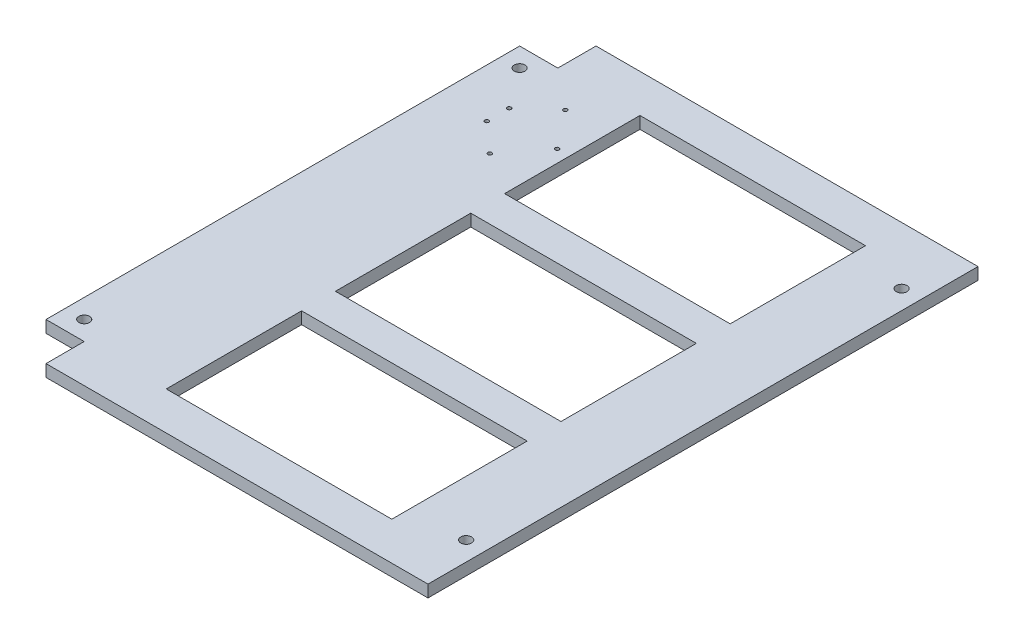
ISO-10303-21;
HEADER;
FILE_DESCRIPTION(('STEP AP214'),'2;1');
FILE_NAME('part.step','',(''),(''),'','','');
FILE_SCHEMA(('AUTOMOTIVE_DESIGN { 1 0 10303 214 1 1 1 1 }'));
ENDSEC;
DATA;
#1=APPLICATION_CONTEXT('core data for automotive mechanical design processes');
#2=APPLICATION_PROTOCOL_DEFINITION('international standard','automotive_design',2000,#1);
#3=PRODUCT_CONTEXT('',#1,'mechanical');
#4=PRODUCT('Part','Part','',(#3));
#5=PRODUCT_RELATED_PRODUCT_CATEGORY('part','',(#4));
#6=PRODUCT_DEFINITION_FORMATION('','',#4);
#7=PRODUCT_DEFINITION_CONTEXT('part definition',#1,'design');
#8=PRODUCT_DEFINITION('design','',#6,#7);
#9=PRODUCT_DEFINITION_SHAPE('','',#8);
#10=(LENGTH_UNIT() NAMED_UNIT(*) SI_UNIT(.MILLI.,.METRE.));
#11=(NAMED_UNIT(*) PLANE_ANGLE_UNIT() SI_UNIT($,.RADIAN.));
#12=(NAMED_UNIT(*) SI_UNIT($,.STERADIAN.) SOLID_ANGLE_UNIT());
#13=UNCERTAINTY_MEASURE_WITH_UNIT(LENGTH_MEASURE(1.E-05),#10,'distance_accuracy_value','');
#14=(GEOMETRIC_REPRESENTATION_CONTEXT(3) GLOBAL_UNCERTAINTY_ASSIGNED_CONTEXT((#13)) GLOBAL_UNIT_ASSIGNED_CONTEXT((#10,
#11,#12)) REPRESENTATION_CONTEXT('',''));
#15=CARTESIAN_POINT('',(0.,0.,0.));
#16=DIRECTION('',(0.,0.,1.));
#17=DIRECTION('',(1.,0.,0.));
#18=AXIS2_PLACEMENT_3D('',#15,#16,#17);
#19=CARTESIAN_POINT('',(0.,8.,0.));
#20=DIRECTION('',(0.,1.,0.));
#21=DIRECTION('',(0.,0.,1.));
#22=AXIS2_PLACEMENT_3D('',#19,#20,#21);
#23=PLANE('',#22);
#24=DIRECTION('',(1.,0.,0.));
#25=VECTOR('',#24,1.);
#26=CARTESIAN_POINT('',(0.,8.,-158.849887640449));
#27=LINE('',#26,#25);
#28=CARTESIAN_POINT('',(-85.7564044943821,8.,-158.849887640449));
#29=VERTEX_POINT('',#28);
#30=CARTESIAN_POINT('',(64.2435955056179,8.,-158.849887640449));
#31=VERTEX_POINT('',#30);
#32=EDGE_CURVE('E253',#29,#31,#27,.T.);
#33=ORIENTED_EDGE('',*,*,#32,.T.);
#34=DIRECTION('',(0.,0.,1.));
#35=VECTOR('',#34,1.);
#36=CARTESIAN_POINT('',(64.2435955056179,8.,0.));
#37=LINE('',#36,#35);
#38=CARTESIAN_POINT('',(64.2435955056179,8.,-68.8498876404494));
#39=VERTEX_POINT('',#38);
#40=EDGE_CURVE('E232',#31,#39,#37,.T.);
#41=ORIENTED_EDGE('',*,*,#40,.T.);
#42=DIRECTION('',(1.,0.,0.));
#43=VECTOR('',#42,1.);
#44=CARTESIAN_POINT('',(0.,8.,-68.8498876404494));
#45=LINE('',#44,#43);
#46=CARTESIAN_POINT('',(-85.7564044943821,8.,-68.8498876404494));
#47=VERTEX_POINT('',#46);
#48=EDGE_CURVE('E242',#47,#39,#45,.T.);
#49=ORIENTED_EDGE('',*,*,#48,.F.);
#50=DIRECTION('',(0.,0.,1.));
#51=VECTOR('',#50,1.);
#52=CARTESIAN_POINT('',(-85.7564044943821,8.,0.));
#53=LINE('',#52,#51);
#54=EDGE_CURVE('E256',#29,#47,#53,.T.);
#55=ORIENTED_EDGE('',*,*,#54,.F.);
#56=EDGE_LOOP('',(#33,#41,#49,#55));
#57=FACE_BOUND('',#56,.T.);
#58=CARTESIAN_POINT('',(-113.748141044183,8.,-137.201092967758));
#59=DIRECTION('',(0.,1.,0.));
#60=DIRECTION('',(0.,0.,-1.));
#61=AXIS2_PLACEMENT_3D('',#58,#59,#60);
#62=CIRCLE('',#61,1.29999999999999);
#63=CARTESIAN_POINT('',(-113.748141044183,8.,-138.501092967758));
#64=VERTEX_POINT('',#63);
#65=EDGE_CURVE('E263',#64,#64,#62,.T.);
#66=ORIENTED_EDGE('',*,*,#65,.F.);
#67=EDGE_LOOP('',(#66));
#68=FACE_BOUND('',#67,.T.);
#69=CARTESIAN_POINT('',(-94.0906410441835,8.,-112.086092967758));
#70=DIRECTION('',(0.,1.,0.));
#71=DIRECTION('',(0.,0.,-1.));
#72=AXIS2_PLACEMENT_3D('',#69,#70,#71);
#73=CIRCLE('',#72,1.30000000000001);
#74=CARTESIAN_POINT('',(-94.0906410441835,8.,-113.386092967758));
#75=VERTEX_POINT('',#74);
#76=EDGE_CURVE('E273',#75,#75,#73,.T.);
#77=ORIENTED_EDGE('',*,*,#76,.F.);
#78=EDGE_LOOP('',(#77));
#79=FACE_BOUND('',#78,.T.);
#80=CARTESIAN_POINT('',(-113.748141044183,8.,-86.9710929677583));
#81=DIRECTION('',(0.,1.,0.));
#82=DIRECTION('',(0.,0.,-1.));
#83=AXIS2_PLACEMENT_3D('',#80,#81,#82);
#84=CIRCLE('',#83,1.29999999999999);
#85=CARTESIAN_POINT('',(-113.748141044183,8.,-88.2710929677583));
#86=VERTEX_POINT('',#85);
#87=EDGE_CURVE('E279',#86,#86,#84,.T.);
#88=ORIENTED_EDGE('',*,*,#87,.F.);
#89=EDGE_LOOP('',(#88));
#90=FACE_BOUND('',#89,.T.);
#91=CARTESIAN_POINT('',(-133.405641044184,8.,-104.641092967758));
#92=DIRECTION('',(0.,1.,0.));
#93=DIRECTION('',(0.,0.,1.));
#94=AXIS2_PLACEMENT_3D('',#91,#92,#93);
#95=CIRCLE('',#94,1.29999999999995);
#96=CARTESIAN_POINT('',(-133.405641044184,8.,-103.341092967758));
#97=VERTEX_POINT('',#96);
#98=EDGE_CURVE('E285',#97,#97,#95,.T.);
#99=ORIENTED_EDGE('',*,*,#98,.F.);
#100=EDGE_LOOP('',(#99));
#101=FACE_BOUND('',#100,.T.);
#102=CARTESIAN_POINT('',(-133.405641044184,8.,-119.531092967758));
#103=DIRECTION('',(0.,1.,0.));
#104=DIRECTION('',(0.,0.,1.));
#105=AXIS2_PLACEMENT_3D('',#102,#103,#104);
#106=CIRCLE('',#105,1.30000000000001);
#107=CARTESIAN_POINT('',(-133.405641044184,8.,-118.231092967758));
#108=VERTEX_POINT('',#107);
#109=EDGE_CURVE('E291',#108,#108,#106,.T.);
#110=ORIENTED_EDGE('',*,*,#109,.F.);
#111=EDGE_LOOP('',(#110));
#112=FACE_BOUND('',#111,.T.);
#113=CARTESIAN_POINT('',(-153.056404494382,8.,-146.129887640449));
#114=DIRECTION('',(0.,1.,0.));
#115=DIRECTION('',(0.,0.,-1.));
#116=AXIS2_PLACEMENT_3D('',#113,#114,#115);
#117=CIRCLE('',#116,3.56999999999998);
#118=CARTESIAN_POINT('',(-153.056404494382,8.,-149.699887640449));
#119=VERTEX_POINT('',#118);
#120=EDGE_CURVE('E297',#119,#119,#117,.T.);
#121=ORIENTED_EDGE('',*,*,#120,.F.);
#122=EDGE_LOOP('',(#121));
#123=FACE_BOUND('',#122,.T.);
#124=CARTESIAN_POINT('',(100.943595505618,8.,143.390112359551));
#125=DIRECTION('',(0.,1.,0.));
#126=DIRECTION('',(0.,0.,-1.));
#127=AXIS2_PLACEMENT_3D('',#124,#125,#126);
#128=CIRCLE('',#127,3.56999999999998);
#129=CARTESIAN_POINT('',(100.943595505618,8.,139.820112359551));
#130=VERTEX_POINT('',#129);
#131=EDGE_CURVE('E303',#130,#130,#128,.T.);
#132=ORIENTED_EDGE('',*,*,#131,.F.);
#133=EDGE_LOOP('',(#132));
#134=FACE_BOUND('',#133,.T.);
#135=CARTESIAN_POINT('',(100.943595505618,8.,-146.129887640449));
#136=DIRECTION('',(0.,1.,0.));
#137=DIRECTION('',(0.,0.,1.));
#138=AXIS2_PLACEMENT_3D('',#135,#136,#137);
#139=CIRCLE('',#138,3.56999999999998);
#140=CARTESIAN_POINT('',(100.943595505618,8.,-142.559887640449));
#141=VERTEX_POINT('',#140);
#142=EDGE_CURVE('E309',#141,#141,#139,.T.);
#143=ORIENTED_EDGE('',*,*,#142,.F.);
#144=EDGE_LOOP('',(#143));
#145=FACE_BOUND('',#144,.T.);
#146=CARTESIAN_POINT('',(-153.056404494382,8.,143.390112359551));
#147=DIRECTION('',(0.,1.,0.));
#148=DIRECTION('',(0.,0.,1.));
#149=AXIS2_PLACEMENT_3D('',#146,#147,#148);
#150=CIRCLE('',#149,3.56999999999998);
#151=CARTESIAN_POINT('',(-153.056404494382,8.,146.96011235955));
#152=VERTEX_POINT('',#151);
#153=EDGE_CURVE('E315',#152,#152,#150,.T.);
#154=ORIENTED_EDGE('',*,*,#153,.F.);
#155=EDGE_LOOP('',(#154));
#156=FACE_BOUND('',#155,.T.);
#157=DIRECTION('',(0.,0.,-1.));
#158=VECTOR('',#157,1.);
#159=CARTESIAN_POINT('',(-140.356404494382,8.,0.));
#160=LINE('',#159,#158);
#161=CARTESIAN_POINT('',(-140.356404494382,8.,-158.849887640449));
#162=VERTEX_POINT('',#161);
#163=CARTESIAN_POINT('',(-140.356404494382,8.,-184.249887640449));
#164=VERTEX_POINT('',#163);
#165=EDGE_CURVE('E324',#162,#164,#160,.T.);
#166=ORIENTED_EDGE('',*,*,#165,.F.);
#167=DIRECTION('',(-1.,0.,0.));
#168=VECTOR('',#167,1.);
#169=CARTESIAN_POINT('',(0.,8.,-158.849887640449));
#170=LINE('',#169,#168);
#171=CARTESIAN_POINT('',(-165.756404494382,8.,-158.849887640449));
#172=VERTEX_POINT('',#171);
#173=EDGE_CURVE('E327',#162,#172,#170,.T.);
#174=ORIENTED_EDGE('',*,*,#173,.T.);
#175=DIRECTION('',(0.,0.,1.));
#176=VECTOR('',#175,1.);
#177=CARTESIAN_POINT('',(-165.756404494382,8.,0.));
#178=LINE('',#177,#176);
#179=CARTESIAN_POINT('',(-165.756404494382,8.,156.110112359551));
#180=VERTEX_POINT('',#179);
#181=EDGE_CURVE('E330',#172,#180,#178,.T.);
#182=ORIENTED_EDGE('',*,*,#181,.T.);
#183=DIRECTION('',(-1.,0.,0.));
#184=VECTOR('',#183,1.);
#185=CARTESIAN_POINT('',(0.,8.,156.110112359551));
#186=LINE('',#185,#184);
#187=CARTESIAN_POINT('',(-140.356404494382,8.,156.110112359551));
#188=VERTEX_POINT('',#187);
#189=EDGE_CURVE('E332',#188,#180,#186,.T.);
#190=ORIENTED_EDGE('',*,*,#189,.F.);
#191=DIRECTION('',(0.,0.,1.));
#192=VECTOR('',#191,1.);
#193=CARTESIAN_POINT('',(-140.356404494382,8.,0.));
#194=LINE('',#193,#192);
#195=CARTESIAN_POINT('',(-140.356404494382,8.,181.510112359551));
#196=VERTEX_POINT('',#195);
#197=EDGE_CURVE('E335',#188,#196,#194,.T.);
#198=ORIENTED_EDGE('',*,*,#197,.T.);
#199=DIRECTION('',(1.,0.,0.));
#200=VECTOR('',#199,1.);
#201=CARTESIAN_POINT('',(0.,8.,181.510112359551));
#202=LINE('',#201,#200);
#203=CARTESIAN_POINT('',(113.643595505618,8.,181.510112359551));
#204=VERTEX_POINT('',#203);
#205=EDGE_CURVE('E337',#196,#204,#202,.T.);
#206=ORIENTED_EDGE('',*,*,#205,.T.);
#207=DIRECTION('',(0.,0.,1.));
#208=VECTOR('',#207,1.);
#209=CARTESIAN_POINT('',(113.643595505618,8.,0.));
#210=LINE('',#209,#208);
#211=CARTESIAN_POINT('',(113.643595505618,8.,-184.249887640449));
#212=VERTEX_POINT('',#211);
#213=EDGE_CURVE('E339',#212,#204,#210,.T.);
#214=ORIENTED_EDGE('',*,*,#213,.F.);
#215=DIRECTION('',(1.,0.,0.));
#216=VECTOR('',#215,1.);
#217=CARTESIAN_POINT('',(0.,8.,-184.249887640449));
#218=LINE('',#217,#216);
#219=EDGE_CURVE('E342',#164,#212,#218,.T.);
#220=ORIENTED_EDGE('',*,*,#219,.F.);
#221=EDGE_LOOP('',(#166,#174,#182,#190,#198,#206,#214,#220));
#222=FACE_BOUND('',#221,.T.);
#223=DIRECTION('',(0.,0.,1.));
#224=VECTOR('',#223,1.);
#225=CARTESIAN_POINT('',(-85.7564044943821,8.,0.));
#226=LINE('',#225,#224);
#227=CARTESIAN_POINT('',(-85.7564044943821,8.,-46.3498876404494));
#228=VERTEX_POINT('',#227);
#229=CARTESIAN_POINT('',(-85.7564044943821,8.,43.6501123595506));
#230=VERTEX_POINT('',#229);
#231=EDGE_CURVE('E204',#228,#230,#226,.T.);
#232=ORIENTED_EDGE('',*,*,#231,.F.);
#233=DIRECTION('',(1.,0.,0.));
#234=VECTOR('',#233,1.);
#235=CARTESIAN_POINT('',(0.,8.,-46.3498876404494));
#236=LINE('',#235,#234);
#237=CARTESIAN_POINT('',(64.2435955056179,8.,-46.3498876404494));
#238=VERTEX_POINT('',#237);
#239=EDGE_CURVE('E212',#228,#238,#236,.T.);
#240=ORIENTED_EDGE('',*,*,#239,.T.);
#241=DIRECTION('',(0.,0.,1.));
#242=VECTOR('',#241,1.);
#243=CARTESIAN_POINT('',(64.2435955056179,8.,0.));
#244=LINE('',#243,#242);
#245=CARTESIAN_POINT('',(64.2435955056179,8.,43.6501123595506));
#246=VERTEX_POINT('',#245);
#247=EDGE_CURVE('E225',#238,#246,#244,.T.);
#248=ORIENTED_EDGE('',*,*,#247,.T.);
#249=DIRECTION('',(1.,0.,0.));
#250=VECTOR('',#249,1.);
#251=CARTESIAN_POINT('',(0.,8.,43.6501123595506));
#252=LINE('',#251,#250);
#253=EDGE_CURVE('E222',#230,#246,#252,.T.);
#254=ORIENTED_EDGE('',*,*,#253,.F.);
#255=EDGE_LOOP('',(#232,#240,#248,#254));
#256=FACE_BOUND('',#255,.T.);
#257=DIRECTION('',(0.,0.,1.));
#258=VECTOR('',#257,1.);
#259=CARTESIAN_POINT('',(-85.7564044943821,8.,0.));
#260=LINE('',#259,#258);
#261=CARTESIAN_POINT('',(-85.7564044943821,8.,66.1501123595505));
#262=VERTEX_POINT('',#261);
#263=CARTESIAN_POINT('',(-85.7564044943821,8.,156.150112359551));
#264=VERTEX_POINT('',#263);
#265=EDGE_CURVE('E198',#262,#264,#260,.T.);
#266=ORIENTED_EDGE('',*,*,#265,.F.);
#267=DIRECTION('',(1.,0.,0.));
#268=VECTOR('',#267,1.);
#269=CARTESIAN_POINT('',(0.,8.,66.1501123595505));
#270=LINE('',#269,#268);
#271=CARTESIAN_POINT('',(64.2435955056179,8.,66.1501123595505));
#272=VERTEX_POINT('',#271);
#273=EDGE_CURVE('E50',#262,#272,#270,.T.);
#274=ORIENTED_EDGE('',*,*,#273,.T.);
#275=DIRECTION('',(0.,0.,1.));
#276=VECTOR('',#275,1.);
#277=CARTESIAN_POINT('',(64.2435955056179,8.,0.));
#278=LINE('',#277,#276);
#279=CARTESIAN_POINT('',(64.2435955056179,8.,156.150112359551));
#280=VERTEX_POINT('',#279);
#281=EDGE_CURVE('E189',#272,#280,#278,.T.);
#282=ORIENTED_EDGE('',*,*,#281,.T.);
#283=DIRECTION('',(1.,0.,0.));
#284=VECTOR('',#283,1.);
#285=CARTESIAN_POINT('',(0.,8.,156.150112359551));
#286=LINE('',#285,#284);
#287=EDGE_CURVE('E192',#264,#280,#286,.T.);
#288=ORIENTED_EDGE('',*,*,#287,.F.);
#289=EDGE_LOOP('',(#266,#274,#282,#288));
#290=FACE_BOUND('',#289,.T.);
#291=ADVANCED_FACE('F35',(#57,#68,#79,#90,#101,#112,#123,#134,#145,#156,#222,#256,#290),#23,.T.);
#292=CARTESIAN_POINT('',(0.,0.,0.));
#293=DIRECTION('',(0.,1.,0.));
#294=DIRECTION('',(0.,0.,1.));
#295=AXIS2_PLACEMENT_3D('',#292,#293,#294);
#296=PLANE('',#295);
#297=DIRECTION('',(0.,0.,1.));
#298=VECTOR('',#297,1.);
#299=CARTESIAN_POINT('',(64.2435955056179,0.,0.));
#300=LINE('',#299,#298);
#301=CARTESIAN_POINT('',(64.2435955056179,0.,-158.849887640449));
#302=VERTEX_POINT('',#301);
#303=CARTESIAN_POINT('',(64.2435955056179,0.,-68.8498876404494));
#304=VERTEX_POINT('',#303);
#305=EDGE_CURVE('E239',#302,#304,#300,.T.);
#306=ORIENTED_EDGE('',*,*,#305,.F.);
#307=DIRECTION('',(1.,0.,0.));
#308=VECTOR('',#307,1.);
#309=CARTESIAN_POINT('',(0.,0.,-158.849887640449));
#310=LINE('',#309,#308);
#311=CARTESIAN_POINT('',(-85.7564044943821,0.,-158.849887640449));
#312=VERTEX_POINT('',#311);
#313=EDGE_CURVE('E241',#312,#302,#310,.T.);
#314=ORIENTED_EDGE('',*,*,#313,.F.);
#315=DIRECTION('',(0.,0.,1.));
#316=VECTOR('',#315,1.);
#317=CARTESIAN_POINT('',(-85.7564044943821,0.,0.));
#318=LINE('',#317,#316);
#319=CARTESIAN_POINT('',(-85.7564044943821,0.,-68.8498876404494));
#320=VERTEX_POINT('',#319);
#321=EDGE_CURVE('E244',#312,#320,#318,.T.);
#322=ORIENTED_EDGE('',*,*,#321,.T.);
#323=DIRECTION('',(1.,0.,0.));
#324=VECTOR('',#323,1.);
#325=CARTESIAN_POINT('',(0.,0.,-68.8498876404494));
#326=LINE('',#325,#324);
#327=EDGE_CURVE('E247',#320,#304,#326,.T.);
#328=ORIENTED_EDGE('',*,*,#327,.T.);
#329=EDGE_LOOP('',(#306,#314,#322,#328));
#330=FACE_BOUND('',#329,.T.);
#331=CARTESIAN_POINT('',(-113.748141044183,0.,-137.201092967758));
#332=DIRECTION('',(0.,1.,0.));
#333=DIRECTION('',(0.,0.,-1.));
#334=AXIS2_PLACEMENT_3D('',#331,#332,#333);
#335=CIRCLE('',#334,1.29999999999999);
#336=CARTESIAN_POINT('',(-113.748141044183,0.,-138.501092967758));
#337=VERTEX_POINT('',#336);
#338=EDGE_CURVE('E270',#337,#337,#335,.T.);
#339=ORIENTED_EDGE('',*,*,#338,.T.);
#340=EDGE_LOOP('',(#339));
#341=FACE_BOUND('',#340,.T.);
#342=CARTESIAN_POINT('',(-94.0906410441835,0.,-112.086092967758));
#343=DIRECTION('',(0.,1.,0.));
#344=DIRECTION('',(0.,0.,-1.));
#345=AXIS2_PLACEMENT_3D('',#342,#343,#344);
#346=CIRCLE('',#345,1.30000000000001);
#347=CARTESIAN_POINT('',(-94.0906410441835,0.,-113.386092967758));
#348=VERTEX_POINT('',#347);
#349=EDGE_CURVE('E276',#348,#348,#346,.T.);
#350=ORIENTED_EDGE('',*,*,#349,.T.);
#351=EDGE_LOOP('',(#350));
#352=FACE_BOUND('',#351,.T.);
#353=CARTESIAN_POINT('',(-113.748141044183,0.,-86.9710929677583));
#354=DIRECTION('',(0.,1.,0.));
#355=DIRECTION('',(0.,0.,-1.));
#356=AXIS2_PLACEMENT_3D('',#353,#354,#355);
#357=CIRCLE('',#356,1.29999999999999);
#358=CARTESIAN_POINT('',(-113.748141044183,0.,-88.2710929677583));
#359=VERTEX_POINT('',#358);
#360=EDGE_CURVE('E282',#359,#359,#357,.T.);
#361=ORIENTED_EDGE('',*,*,#360,.T.);
#362=EDGE_LOOP('',(#361));
#363=FACE_BOUND('',#362,.T.);
#364=CARTESIAN_POINT('',(-133.405641044184,0.,-104.641092967758));
#365=DIRECTION('',(0.,1.,0.));
#366=DIRECTION('',(0.,0.,1.));
#367=AXIS2_PLACEMENT_3D('',#364,#365,#366);
#368=CIRCLE('',#367,1.29999999999995);
#369=CARTESIAN_POINT('',(-133.405641044184,0.,-103.341092967758));
#370=VERTEX_POINT('',#369);
#371=EDGE_CURVE('E288',#370,#370,#368,.T.);
#372=ORIENTED_EDGE('',*,*,#371,.T.);
#373=EDGE_LOOP('',(#372));
#374=FACE_BOUND('',#373,.T.);
#375=CARTESIAN_POINT('',(-133.405641044184,0.,-119.531092967758));
#376=DIRECTION('',(0.,1.,0.));
#377=DIRECTION('',(0.,0.,1.));
#378=AXIS2_PLACEMENT_3D('',#375,#376,#377);
#379=CIRCLE('',#378,1.30000000000001);
#380=CARTESIAN_POINT('',(-133.405641044184,0.,-118.231092967758));
#381=VERTEX_POINT('',#380);
#382=EDGE_CURVE('E294',#381,#381,#379,.T.);
#383=ORIENTED_EDGE('',*,*,#382,.T.);
#384=EDGE_LOOP('',(#383));
#385=FACE_BOUND('',#384,.T.);
#386=CARTESIAN_POINT('',(-153.056404494382,0.,-146.129887640449));
#387=DIRECTION('',(0.,1.,0.));
#388=DIRECTION('',(0.,0.,-1.));
#389=AXIS2_PLACEMENT_3D('',#386,#387,#388);
#390=CIRCLE('',#389,3.56999999999998);
#391=CARTESIAN_POINT('',(-153.056404494382,0.,-149.699887640449));
#392=VERTEX_POINT('',#391);
#393=EDGE_CURVE('E300',#392,#392,#390,.T.);
#394=ORIENTED_EDGE('',*,*,#393,.T.);
#395=EDGE_LOOP('',(#394));
#396=FACE_BOUND('',#395,.T.);
#397=CARTESIAN_POINT('',(100.943595505618,0.,143.390112359551));
#398=DIRECTION('',(0.,1.,0.));
#399=DIRECTION('',(0.,0.,-1.));
#400=AXIS2_PLACEMENT_3D('',#397,#398,#399);
#401=CIRCLE('',#400,3.56999999999998);
#402=CARTESIAN_POINT('',(100.943595505618,0.,139.820112359551));
#403=VERTEX_POINT('',#402);
#404=EDGE_CURVE('E306',#403,#403,#401,.T.);
#405=ORIENTED_EDGE('',*,*,#404,.T.);
#406=EDGE_LOOP('',(#405));
#407=FACE_BOUND('',#406,.T.);
#408=CARTESIAN_POINT('',(100.943595505618,0.,-146.129887640449));
#409=DIRECTION('',(0.,1.,0.));
#410=DIRECTION('',(0.,0.,1.));
#411=AXIS2_PLACEMENT_3D('',#408,#409,#410);
#412=CIRCLE('',#411,3.56999999999998);
#413=CARTESIAN_POINT('',(100.943595505618,0.,-142.559887640449));
#414=VERTEX_POINT('',#413);
#415=EDGE_CURVE('E312',#414,#414,#412,.T.);
#416=ORIENTED_EDGE('',*,*,#415,.T.);
#417=EDGE_LOOP('',(#416));
#418=FACE_BOUND('',#417,.T.);
#419=CARTESIAN_POINT('',(-153.056404494382,0.,143.390112359551));
#420=DIRECTION('',(0.,1.,0.));
#421=DIRECTION('',(0.,0.,1.));
#422=AXIS2_PLACEMENT_3D('',#419,#420,#421);
#423=CIRCLE('',#422,3.56999999999998);
#424=CARTESIAN_POINT('',(-153.056404494382,0.,146.96011235955));
#425=VERTEX_POINT('',#424);
#426=EDGE_CURVE('E318',#425,#425,#423,.T.);
#427=ORIENTED_EDGE('',*,*,#426,.T.);
#428=EDGE_LOOP('',(#427));
#429=FACE_BOUND('',#428,.T.);
#430=DIRECTION('',(0.,0.,-1.));
#431=VECTOR('',#430,1.);
#432=CARTESIAN_POINT('',(-140.356404494382,0.,0.));
#433=LINE('',#432,#431);
#434=CARTESIAN_POINT('',(-140.356404494382,0.,-158.849887640449));
#435=VERTEX_POINT('',#434);
#436=CARTESIAN_POINT('',(-140.356404494382,0.,-184.249887640449));
#437=VERTEX_POINT('',#436);
#438=EDGE_CURVE('E321',#435,#437,#433,.T.);
#439=ORIENTED_EDGE('',*,*,#438,.T.);
#440=DIRECTION('',(1.,0.,0.));
#441=VECTOR('',#440,1.);
#442=CARTESIAN_POINT('',(0.,0.,-184.249887640449));
#443=LINE('',#442,#441);
#444=CARTESIAN_POINT('',(113.643595505618,0.,-184.249887640449));
#445=VERTEX_POINT('',#444);
#446=EDGE_CURVE('E328',#437,#445,#443,.T.);
#447=ORIENTED_EDGE('',*,*,#446,.T.);
#448=DIRECTION('',(0.,0.,1.));
#449=VECTOR('',#448,1.);
#450=CARTESIAN_POINT('',(113.643595505618,0.,0.));
#451=LINE('',#450,#449);
#452=CARTESIAN_POINT('',(113.643595505618,0.,181.510112359551));
#453=VERTEX_POINT('',#452);
#454=EDGE_CURVE('E361',#445,#453,#451,.T.);
#455=ORIENTED_EDGE('',*,*,#454,.T.);
#456=DIRECTION('',(1.,0.,0.));
#457=VECTOR('',#456,1.);
#458=CARTESIAN_POINT('',(0.,0.,181.510112359551));
#459=LINE('',#458,#457);
#460=CARTESIAN_POINT('',(-140.356404494382,0.,181.510112359551));
#461=VERTEX_POINT('',#460);
#462=EDGE_CURVE('E358',#461,#453,#459,.T.);
#463=ORIENTED_EDGE('',*,*,#462,.F.);
#464=DIRECTION('',(0.,0.,1.));
#465=VECTOR('',#464,1.);
#466=CARTESIAN_POINT('',(-140.356404494382,0.,0.));
#467=LINE('',#466,#465);
#468=CARTESIAN_POINT('',(-140.356404494382,0.,156.110112359551));
#469=VERTEX_POINT('',#468);
#470=EDGE_CURVE('E356',#469,#461,#467,.T.);
#471=ORIENTED_EDGE('',*,*,#470,.F.);
#472=DIRECTION('',(-1.,0.,0.));
#473=VECTOR('',#472,1.);
#474=CARTESIAN_POINT('',(0.,0.,156.110112359551));
#475=LINE('',#474,#473);
#476=CARTESIAN_POINT('',(-165.756404494382,0.,156.110112359551));
#477=VERTEX_POINT('',#476);
#478=EDGE_CURVE('E353',#469,#477,#475,.T.);
#479=ORIENTED_EDGE('',*,*,#478,.T.);
#480=DIRECTION('',(0.,0.,1.));
#481=VECTOR('',#480,1.);
#482=CARTESIAN_POINT('',(-165.756404494382,0.,0.));
#483=LINE('',#482,#481);
#484=CARTESIAN_POINT('',(-165.756404494382,0.,-158.849887640449));
#485=VERTEX_POINT('',#484);
#486=EDGE_CURVE('E350',#485,#477,#483,.T.);
#487=ORIENTED_EDGE('',*,*,#486,.F.);
#488=DIRECTION('',(-1.,0.,0.));
#489=VECTOR('',#488,1.);
#490=CARTESIAN_POINT('',(0.,0.,-158.849887640449));
#491=LINE('',#490,#489);
#492=EDGE_CURVE('E348',#435,#485,#491,.T.);
#493=ORIENTED_EDGE('',*,*,#492,.F.);
#494=EDGE_LOOP('',(#439,#447,#455,#463,#471,#479,#487,#493));
#495=FACE_BOUND('',#494,.T.);
#496=DIRECTION('',(1.,0.,0.));
#497=VECTOR('',#496,1.);
#498=CARTESIAN_POINT('',(0.,0.,-46.3498876404494));
#499=LINE('',#498,#497);
#500=CARTESIAN_POINT('',(-85.7564044943821,0.,-46.3498876404494));
#501=VERTEX_POINT('',#500);
#502=CARTESIAN_POINT('',(64.2435955056179,0.,-46.3498876404494));
#503=VERTEX_POINT('',#502);
#504=EDGE_CURVE('E218',#501,#503,#499,.T.);
#505=ORIENTED_EDGE('',*,*,#504,.F.);
#506=DIRECTION('',(0.,0.,1.));
#507=VECTOR('',#506,1.);
#508=CARTESIAN_POINT('',(-85.7564044943821,0.,0.));
#509=LINE('',#508,#507);
#510=CARTESIAN_POINT('',(-85.7564044943821,0.,43.6501123595506));
#511=VERTEX_POINT('',#510);
#512=EDGE_CURVE('E208',#501,#511,#509,.T.);
#513=ORIENTED_EDGE('',*,*,#512,.T.);
#514=DIRECTION('',(1.,0.,0.));
#515=VECTOR('',#514,1.);
#516=CARTESIAN_POINT('',(0.,0.,43.6501123595506));
#517=LINE('',#516,#515);
#518=CARTESIAN_POINT('',(64.2435955056179,0.,43.6501123595506));
#519=VERTEX_POINT('',#518);
#520=EDGE_CURVE('E211',#511,#519,#517,.T.);
#521=ORIENTED_EDGE('',*,*,#520,.T.);
#522=DIRECTION('',(0.,0.,1.));
#523=VECTOR('',#522,1.);
#524=CARTESIAN_POINT('',(64.2435955056179,0.,0.));
#525=LINE('',#524,#523);
#526=EDGE_CURVE('E215',#503,#519,#525,.T.);
#527=ORIENTED_EDGE('',*,*,#526,.F.);
#528=EDGE_LOOP('',(#505,#513,#521,#527));
#529=FACE_BOUND('',#528,.T.);
#530=DIRECTION('',(1.,0.,0.));
#531=VECTOR('',#530,1.);
#532=CARTESIAN_POINT('',(0.,0.,66.1501123595505));
#533=LINE('',#532,#531);
#534=CARTESIAN_POINT('',(-85.7564044943821,0.,66.1501123595505));
#535=VERTEX_POINT('',#534);
#536=CARTESIAN_POINT('',(64.2435955056179,0.,66.1501123595505));
#537=VERTEX_POINT('',#536);
#538=EDGE_CURVE('E174',#535,#537,#533,.T.);
#539=ORIENTED_EDGE('',*,*,#538,.F.);
#540=DIRECTION('',(0.,0.,1.));
#541=VECTOR('',#540,1.);
#542=CARTESIAN_POINT('',(-85.7564044943821,0.,0.));
#543=LINE('',#542,#541);
#544=CARTESIAN_POINT('',(-85.7564044943821,0.,156.150112359551));
#545=VERTEX_POINT('',#544);
#546=EDGE_CURVE('E183',#535,#545,#543,.T.);
#547=ORIENTED_EDGE('',*,*,#546,.T.);
#548=DIRECTION('',(1.,0.,0.));
#549=VECTOR('',#548,1.);
#550=CARTESIAN_POINT('',(0.,0.,156.150112359551));
#551=LINE('',#550,#549);
#552=CARTESIAN_POINT('',(64.2435955056179,0.,156.150112359551));
#553=VERTEX_POINT('',#552);
#554=EDGE_CURVE('E58',#545,#553,#551,.T.);
#555=ORIENTED_EDGE('',*,*,#554,.T.);
#556=DIRECTION('',(0.,0.,1.));
#557=VECTOR('',#556,1.);
#558=CARTESIAN_POINT('',(64.2435955056179,0.,0.));
#559=LINE('',#558,#557);
#560=EDGE_CURVE('E180',#537,#553,#559,.T.);
#561=ORIENTED_EDGE('',*,*,#560,.F.);
#562=EDGE_LOOP('',(#539,#547,#555,#561));
#563=FACE_BOUND('',#562,.T.);
#564=ADVANCED_FACE('F188',(#330,#341,#352,#363,#374,#385,#396,#407,#418,#429,#495,#529,#563),
#296,.F.);
#565=CARTESIAN_POINT('',(-140.356404494382,8.,0.));
#566=DIRECTION('',(-1.,0.,0.));
#567=DIRECTION('',(0.,0.,1.));
#568=AXIS2_PLACEMENT_3D('',#565,#566,#567);
#569=PLANE('',#568);
#570=ORIENTED_EDGE('',*,*,#438,.F.);
#571=DIRECTION('',(0.,-1.,0.));
#572=VECTOR('',#571,1.);
#573=CARTESIAN_POINT('',(-140.356404494382,8.,-158.849887640449));
#574=LINE('',#573,#572);
#575=EDGE_CURVE('E11',#162,#435,#574,.T.);
#576=ORIENTED_EDGE('',*,*,#575,.F.);
#577=ORIENTED_EDGE('',*,*,#165,.T.);
#578=DIRECTION('',(0.,-1.,0.));
#579=VECTOR('',#578,1.);
#580=CARTESIAN_POINT('',(-140.356404494382,8.,-184.249887640449));
#581=LINE('',#580,#579);
#582=EDGE_CURVE('E345',#164,#437,#581,.T.);
#583=ORIENTED_EDGE('',*,*,#582,.T.);
#584=EDGE_LOOP('',(#570,#576,#577,#583));
#585=FACE_BOUND('',#584,.T.);
#586=ADVANCED_FACE('F37',(#585),#569,.T.);
#587=CARTESIAN_POINT('',(0.,8.,-158.849887640449));
#588=DIRECTION('',(0.,0.,1.));
#589=DIRECTION('',(1.,0.,0.));
#590=AXIS2_PLACEMENT_3D('',#587,#588,#589);
#591=PLANE('',#590);
#592=ORIENTED_EDGE('',*,*,#492,.T.);
#593=DIRECTION('',(0.,-1.,0.));
#594=VECTOR('',#593,1.);
#595=CARTESIAN_POINT('',(-165.756404494382,8.,-158.849887640449));
#596=LINE('',#595,#594);
#597=EDGE_CURVE('E43',#172,#485,#596,.T.);
#598=ORIENTED_EDGE('',*,*,#597,.F.);
#599=ORIENTED_EDGE('',*,*,#173,.F.);
#600=ORIENTED_EDGE('',*,*,#575,.T.);
#601=EDGE_LOOP('',(#592,#598,#599,#600));
#602=FACE_BOUND('',#601,.T.);
#603=ADVANCED_FACE('F402',(#602),#591,.F.);
#604=CARTESIAN_POINT('',(-165.756404494382,8.,0.));
#605=DIRECTION('',(1.,0.,0.));
#606=DIRECTION('',(0.,0.,-1.));
#607=AXIS2_PLACEMENT_3D('',#604,#605,#606);
#608=PLANE('',#607);
#609=ORIENTED_EDGE('',*,*,#486,.T.);
#610=DIRECTION('',(0.,-1.,0.));
#611=VECTOR('',#610,1.);
#612=CARTESIAN_POINT('',(-165.756404494382,8.,156.110112359551));
#613=LINE('',#612,#611);
#614=EDGE_CURVE('E376',#180,#477,#613,.T.);
#615=ORIENTED_EDGE('',*,*,#614,.F.);
#616=ORIENTED_EDGE('',*,*,#181,.F.);
#617=ORIENTED_EDGE('',*,*,#597,.T.);
#618=EDGE_LOOP('',(#609,#615,#616,#617));
#619=FACE_BOUND('',#618,.T.);
#620=ADVANCED_FACE('F382',(#619),#608,.F.);
#621=CARTESIAN_POINT('',(0.,8.,156.110112359551));
#622=DIRECTION('',(0.,0.,1.));
#623=DIRECTION('',(1.,0.,0.));
#624=AXIS2_PLACEMENT_3D('',#621,#622,#623);
#625=PLANE('',#624);
#626=ORIENTED_EDGE('',*,*,#478,.F.);
#627=DIRECTION('',(0.,-1.,0.));
#628=VECTOR('',#627,1.);
#629=CARTESIAN_POINT('',(-140.356404494382,8.,156.110112359551));
#630=LINE('',#629,#628);
#631=EDGE_CURVE('E374',#188,#469,#630,.T.);
#632=ORIENTED_EDGE('',*,*,#631,.F.);
#633=ORIENTED_EDGE('',*,*,#189,.T.);
#634=ORIENTED_EDGE('',*,*,#614,.T.);
#635=EDGE_LOOP('',(#626,#632,#633,#634));
#636=FACE_BOUND('',#635,.T.);
#637=ADVANCED_FACE('F394',(#636),#625,.T.);
#638=CARTESIAN_POINT('',(-140.356404494382,8.,0.));
#639=DIRECTION('',(1.,0.,0.));
#640=DIRECTION('',(0.,0.,-1.));
#641=AXIS2_PLACEMENT_3D('',#638,#639,#640);
#642=PLANE('',#641);
#643=ORIENTED_EDGE('',*,*,#470,.T.);
#644=DIRECTION('',(0.,-1.,0.));
#645=VECTOR('',#644,1.);
#646=CARTESIAN_POINT('',(-140.356404494382,8.,181.510112359551));
#647=LINE('',#646,#645);
#648=EDGE_CURVE('E371',#196,#461,#647,.T.);
#649=ORIENTED_EDGE('',*,*,#648,.F.);
#650=ORIENTED_EDGE('',*,*,#197,.F.);
#651=ORIENTED_EDGE('',*,*,#631,.T.);
#652=EDGE_LOOP('',(#643,#649,#650,#651));
#653=FACE_BOUND('',#652,.T.);
#654=ADVANCED_FACE('F416',(#653),#642,.F.);
#655=CARTESIAN_POINT('',(0.,8.,181.510112359551));
#656=DIRECTION('',(0.,0.,-1.));
#657=DIRECTION('',(-1.,0.,0.));
#658=AXIS2_PLACEMENT_3D('',#655,#656,#657);
#659=PLANE('',#658);
#660=ORIENTED_EDGE('',*,*,#462,.T.);
#661=DIRECTION('',(0.,-1.,0.));
#662=VECTOR('',#661,1.);
#663=CARTESIAN_POINT('',(113.643595505618,8.,181.510112359551));
#664=LINE('',#663,#662);
#665=EDGE_CURVE('E369',#204,#453,#664,.T.);
#666=ORIENTED_EDGE('',*,*,#665,.F.);
#667=ORIENTED_EDGE('',*,*,#205,.F.);
#668=ORIENTED_EDGE('',*,*,#648,.T.);
#669=EDGE_LOOP('',(#660,#666,#667,#668));
#670=FACE_BOUND('',#669,.T.);
#671=ADVANCED_FACE('F413',(#670),#659,.F.);
#672=CARTESIAN_POINT('',(113.643595505618,8.,0.));
#673=DIRECTION('',(1.,0.,0.));
#674=DIRECTION('',(0.,0.,-1.));
#675=AXIS2_PLACEMENT_3D('',#672,#673,#674);
#676=PLANE('',#675);
#677=ORIENTED_EDGE('',*,*,#454,.F.);
#678=DIRECTION('',(0.,-1.,0.));
#679=VECTOR('',#678,1.);
#680=CARTESIAN_POINT('',(113.643595505618,8.,-184.249887640449));
#681=LINE('',#680,#679);
#682=EDGE_CURVE('E367',#212,#445,#681,.T.);
#683=ORIENTED_EDGE('',*,*,#682,.F.);
#684=ORIENTED_EDGE('',*,*,#213,.T.);
#685=ORIENTED_EDGE('',*,*,#665,.T.);
#686=EDGE_LOOP('',(#677,#683,#684,#685));
#687=FACE_BOUND('',#686,.T.);
#688=ADVANCED_FACE('F410',(#687),#676,.T.);
#689=CARTESIAN_POINT('',(0.,8.,-184.249887640449));
#690=DIRECTION('',(0.,0.,-1.));
#691=DIRECTION('',(-1.,0.,0.));
#692=AXIS2_PLACEMENT_3D('',#689,#690,#691);
#693=PLANE('',#692);
#694=ORIENTED_EDGE('',*,*,#446,.F.);
#695=ORIENTED_EDGE('',*,*,#582,.F.);
#696=ORIENTED_EDGE('',*,*,#219,.T.);
#697=ORIENTED_EDGE('',*,*,#682,.T.);
#698=EDGE_LOOP('',(#694,#695,#696,#697));
#699=FACE_BOUND('',#698,.T.);
#700=ADVANCED_FACE('F406',(#699),#693,.T.);
#701=CARTESIAN_POINT('',(-153.056404494382,0.,143.390112359551));
#702=DIRECTION('',(0.,1.,0.));
#703=DIRECTION('',(0.,0.,1.));
#704=AXIS2_PLACEMENT_3D('',#701,#702,#703);
#705=CYLINDRICAL_SURFACE('',#704,3.56999999999998);
#706=ORIENTED_EDGE('',*,*,#426,.F.);
#707=EDGE_LOOP('',(#706));
#708=FACE_BOUND('',#707,.T.);
#709=ORIENTED_EDGE('',*,*,#153,.T.);
#710=EDGE_LOOP('',(#709));
#711=FACE_BOUND('',#710,.T.);
#712=ADVANCED_FACE('F435',(#708,#711),#705,.F.);
#713=CARTESIAN_POINT('',(100.943595505618,0.,-146.129887640449));
#714=DIRECTION('',(0.,1.,0.));
#715=DIRECTION('',(0.,0.,1.));
#716=AXIS2_PLACEMENT_3D('',#713,#714,#715);
#717=CYLINDRICAL_SURFACE('',#716,3.56999999999998);
#718=ORIENTED_EDGE('',*,*,#415,.F.);
#719=EDGE_LOOP('',(#718));
#720=FACE_BOUND('',#719,.T.);
#721=ORIENTED_EDGE('',*,*,#142,.T.);
#722=EDGE_LOOP('',(#721));
#723=FACE_BOUND('',#722,.T.);
#724=ADVANCED_FACE('F455',(#720,#723),#717,.F.);
#725=CARTESIAN_POINT('',(100.943595505618,0.,143.390112359551));
#726=DIRECTION('',(0.,1.,0.));
#727=DIRECTION('',(0.,0.,1.));
#728=AXIS2_PLACEMENT_3D('',#725,#726,#727);
#729=CYLINDRICAL_SURFACE('',#728,3.56999999999998);
#730=ORIENTED_EDGE('',*,*,#404,.F.);
#731=EDGE_LOOP('',(#730));
#732=FACE_BOUND('',#731,.T.);
#733=ORIENTED_EDGE('',*,*,#131,.T.);
#734=EDGE_LOOP('',(#733));
#735=FACE_BOUND('',#734,.T.);
#736=ADVANCED_FACE('F462',(#732,#735),#729,.F.);
#737=CARTESIAN_POINT('',(-153.056404494382,0.,-146.129887640449));
#738=DIRECTION('',(0.,1.,0.));
#739=DIRECTION('',(0.,0.,1.));
#740=AXIS2_PLACEMENT_3D('',#737,#738,#739);
#741=CYLINDRICAL_SURFACE('',#740,3.56999999999998);
#742=ORIENTED_EDGE('',*,*,#393,.F.);
#743=EDGE_LOOP('',(#742));
#744=FACE_BOUND('',#743,.T.);
#745=ORIENTED_EDGE('',*,*,#120,.T.);
#746=EDGE_LOOP('',(#745));
#747=FACE_BOUND('',#746,.T.);
#748=ADVANCED_FACE('F469',(#744,#747),#741,.F.);
#749=CARTESIAN_POINT('',(-133.405641044184,0.,-119.531092967758));
#750=DIRECTION('',(0.,1.,0.));
#751=DIRECTION('',(0.,0.,1.));
#752=AXIS2_PLACEMENT_3D('',#749,#750,#751);
#753=CYLINDRICAL_SURFACE('',#752,1.30000000000001);
#754=ORIENTED_EDGE('',*,*,#382,.F.);
#755=EDGE_LOOP('',(#754));
#756=FACE_BOUND('',#755,.T.);
#757=ORIENTED_EDGE('',*,*,#109,.T.);
#758=EDGE_LOOP('',(#757));
#759=FACE_BOUND('',#758,.T.);
#760=ADVANCED_FACE('F477',(#756,#759),#753,.F.);
#761=CARTESIAN_POINT('',(-133.405641044184,0.,-104.641092967758));
#762=DIRECTION('',(0.,1.,0.));
#763=DIRECTION('',(0.,0.,1.));
#764=AXIS2_PLACEMENT_3D('',#761,#762,#763);
#765=CYLINDRICAL_SURFACE('',#764,1.29999999999995);
#766=ORIENTED_EDGE('',*,*,#371,.F.);
#767=EDGE_LOOP('',(#766));
#768=FACE_BOUND('',#767,.T.);
#769=ORIENTED_EDGE('',*,*,#98,.T.);
#770=EDGE_LOOP('',(#769));
#771=FACE_BOUND('',#770,.T.);
#772=ADVANCED_FACE('F485',(#768,#771),#765,.F.);
#773=CARTESIAN_POINT('',(-113.748141044183,0.,-86.9710929677583));
#774=DIRECTION('',(0.,1.,0.));
#775=DIRECTION('',(0.,0.,1.));
#776=AXIS2_PLACEMENT_3D('',#773,#774,#775);
#777=CYLINDRICAL_SURFACE('',#776,1.29999999999999);
#778=ORIENTED_EDGE('',*,*,#360,.F.);
#779=EDGE_LOOP('',(#778));
#780=FACE_BOUND('',#779,.T.);
#781=ORIENTED_EDGE('',*,*,#87,.T.);
#782=EDGE_LOOP('',(#781));
#783=FACE_BOUND('',#782,.T.);
#784=ADVANCED_FACE('F493',(#780,#783),#777,.F.);
#785=CARTESIAN_POINT('',(-94.0906410441835,0.,-112.086092967758));
#786=DIRECTION('',(0.,1.,0.));
#787=DIRECTION('',(0.,0.,1.));
#788=AXIS2_PLACEMENT_3D('',#785,#786,#787);
#789=CYLINDRICAL_SURFACE('',#788,1.30000000000001);
#790=ORIENTED_EDGE('',*,*,#349,.F.);
#791=EDGE_LOOP('',(#790));
#792=FACE_BOUND('',#791,.T.);
#793=ORIENTED_EDGE('',*,*,#76,.T.);
#794=EDGE_LOOP('',(#793));
#795=FACE_BOUND('',#794,.T.);
#796=ADVANCED_FACE('F501',(#792,#795),#789,.F.);
#797=CARTESIAN_POINT('',(-113.748141044183,0.,-137.201092967758));
#798=DIRECTION('',(0.,1.,0.));
#799=DIRECTION('',(0.,0.,1.));
#800=AXIS2_PLACEMENT_3D('',#797,#798,#799);
#801=CYLINDRICAL_SURFACE('',#800,1.29999999999999);
#802=ORIENTED_EDGE('',*,*,#338,.F.);
#803=EDGE_LOOP('',(#802));
#804=FACE_BOUND('',#803,.T.);
#805=ORIENTED_EDGE('',*,*,#65,.T.);
#806=EDGE_LOOP('',(#805));
#807=FACE_BOUND('',#806,.T.);
#808=ADVANCED_FACE('F509',(#804,#807),#801,.F.);
#809=CARTESIAN_POINT('',(64.2435955056179,0.,0.));
#810=DIRECTION('',(-1.,0.,0.));
#811=DIRECTION('',(0.,0.,1.));
#812=AXIS2_PLACEMENT_3D('',#809,#810,#811);
#813=PLANE('',#812);
#814=ORIENTED_EDGE('',*,*,#40,.F.);
#815=DIRECTION('',(0.,1.,0.));
#816=VECTOR('',#815,1.);
#817=CARTESIAN_POINT('',(64.2435955056179,0.,-158.849887640449));
#818=LINE('',#817,#816);
#819=EDGE_CURVE('E250',#302,#31,#818,.T.);
#820=ORIENTED_EDGE('',*,*,#819,.F.);
#821=ORIENTED_EDGE('',*,*,#305,.T.);
#822=DIRECTION('',(0.,1.,0.));
#823=VECTOR('',#822,1.);
#824=CARTESIAN_POINT('',(64.2435955056179,0.,-68.8498876404494));
#825=LINE('',#824,#823);
#826=EDGE_CURVE('E261',#304,#39,#825,.T.);
#827=ORIENTED_EDGE('',*,*,#826,.T.);
#828=EDGE_LOOP('',(#814,#820,#821,#827));
#829=FACE_BOUND('',#828,.T.);
#830=ADVANCED_FACE('F517',(#829),#813,.T.);
#831=CARTESIAN_POINT('',(0.,0.,-68.8498876404494));
#832=DIRECTION('',(0.,0.,1.));
#833=DIRECTION('',(1.,0.,0.));
#834=AXIS2_PLACEMENT_3D('',#831,#832,#833);
#835=PLANE('',#834);
#836=ORIENTED_EDGE('',*,*,#48,.T.);
#837=ORIENTED_EDGE('',*,*,#826,.F.);
#838=ORIENTED_EDGE('',*,*,#327,.F.);
#839=DIRECTION('',(0.,1.,0.));
#840=VECTOR('',#839,1.);
#841=CARTESIAN_POINT('',(-85.7564044943821,0.,-68.8498876404494));
#842=LINE('',#841,#840);
#843=EDGE_CURVE('E264',#320,#47,#842,.T.);
#844=ORIENTED_EDGE('',*,*,#843,.T.);
#845=EDGE_LOOP('',(#836,#837,#838,#844));
#846=FACE_BOUND('',#845,.T.);
#847=ADVANCED_FACE('F525',(#846),#835,.F.);
#848=CARTESIAN_POINT('',(-85.7564044943821,0.,0.));
#849=DIRECTION('',(-1.,0.,0.));
#850=DIRECTION('',(0.,0.,1.));
#851=AXIS2_PLACEMENT_3D('',#848,#849,#850);
#852=PLANE('',#851);
#853=ORIENTED_EDGE('',*,*,#54,.T.);
#854=ORIENTED_EDGE('',*,*,#843,.F.);
#855=ORIENTED_EDGE('',*,*,#321,.F.);
#856=DIRECTION('',(0.,1.,0.));
#857=VECTOR('',#856,1.);
#858=CARTESIAN_POINT('',(-85.7564044943821,0.,-158.849887640449));
#859=LINE('',#858,#857);
#860=EDGE_CURVE('E266',#312,#29,#859,.T.);
#861=ORIENTED_EDGE('',*,*,#860,.T.);
#862=EDGE_LOOP('',(#853,#854,#855,#861));
#863=FACE_BOUND('',#862,.T.);
#864=ADVANCED_FACE('F534',(#863),#852,.F.);
#865=CARTESIAN_POINT('',(0.,0.,-158.849887640449));
#866=DIRECTION('',(0.,0.,1.));
#867=DIRECTION('',(1.,0.,0.));
#868=AXIS2_PLACEMENT_3D('',#865,#866,#867);
#869=PLANE('',#868);
#870=ORIENTED_EDGE('',*,*,#32,.F.);
#871=ORIENTED_EDGE('',*,*,#860,.F.);
#872=ORIENTED_EDGE('',*,*,#313,.T.);
#873=ORIENTED_EDGE('',*,*,#819,.T.);
#874=EDGE_LOOP('',(#870,#871,#872,#873));
#875=FACE_BOUND('',#874,.T.);
#876=ADVANCED_FACE('F542',(#875),#869,.T.);
#877=CARTESIAN_POINT('',(-85.7564044943821,0.,0.));
#878=DIRECTION('',(-1.,0.,0.));
#879=DIRECTION('',(0.,0.,1.));
#880=AXIS2_PLACEMENT_3D('',#877,#878,#879);
#881=PLANE('',#880);
#882=ORIENTED_EDGE('',*,*,#231,.T.);
#883=DIRECTION('',(0.,1.,0.));
#884=VECTOR('',#883,1.);
#885=CARTESIAN_POINT('',(-85.7564044943821,0.,43.6501123595506));
#886=LINE('',#885,#884);
#887=EDGE_CURVE('E220',#511,#230,#886,.T.);
#888=ORIENTED_EDGE('',*,*,#887,.F.);
#889=ORIENTED_EDGE('',*,*,#512,.F.);
#890=DIRECTION('',(0.,1.,0.));
#891=VECTOR('',#890,1.);
#892=CARTESIAN_POINT('',(-85.7564044943821,0.,-46.3498876404494));
#893=LINE('',#892,#891);
#894=EDGE_CURVE('E230',#501,#228,#893,.T.);
#895=ORIENTED_EDGE('',*,*,#894,.T.);
#896=EDGE_LOOP('',(#882,#888,#889,#895));
#897=FACE_BOUND('',#896,.T.);
#898=ADVANCED_FACE('F550',(#897),#881,.F.);
#899=CARTESIAN_POINT('',(0.,0.,-46.3498876404494));
#900=DIRECTION('',(0.,0.,1.));
#901=DIRECTION('',(1.,0.,0.));
#902=AXIS2_PLACEMENT_3D('',#899,#900,#901);
#903=PLANE('',#902);
#904=ORIENTED_EDGE('',*,*,#239,.F.);
#905=ORIENTED_EDGE('',*,*,#894,.F.);
#906=ORIENTED_EDGE('',*,*,#504,.T.);
#907=DIRECTION('',(0.,1.,0.));
#908=VECTOR('',#907,1.);
#909=CARTESIAN_POINT('',(64.2435955056179,0.,-46.3498876404494));
#910=LINE('',#909,#908);
#911=EDGE_CURVE('E233',#503,#238,#910,.T.);
#912=ORIENTED_EDGE('',*,*,#911,.T.);
#913=EDGE_LOOP('',(#904,#905,#906,#912));
#914=FACE_BOUND('',#913,.T.);
#915=ADVANCED_FACE('F558',(#914),#903,.T.);
#916=CARTESIAN_POINT('',(64.2435955056179,0.,0.));
#917=DIRECTION('',(-1.,0.,0.));
#918=DIRECTION('',(0.,0.,1.));
#919=AXIS2_PLACEMENT_3D('',#916,#917,#918);
#920=PLANE('',#919);
#921=ORIENTED_EDGE('',*,*,#247,.F.);
#922=ORIENTED_EDGE('',*,*,#911,.F.);
#923=ORIENTED_EDGE('',*,*,#526,.T.);
#924=DIRECTION('',(0.,1.,0.));
#925=VECTOR('',#924,1.);
#926=CARTESIAN_POINT('',(64.2435955056179,0.,43.6501123595506));
#927=LINE('',#926,#925);
#928=EDGE_CURVE('E235',#519,#246,#927,.T.);
#929=ORIENTED_EDGE('',*,*,#928,.T.);
#930=EDGE_LOOP('',(#921,#922,#923,#929));
#931=FACE_BOUND('',#930,.T.);
#932=ADVANCED_FACE('F566',(#931),#920,.T.);
#933=CARTESIAN_POINT('',(0.,0.,43.6501123595506));
#934=DIRECTION('',(0.,0.,1.));
#935=DIRECTION('',(1.,0.,0.));
#936=AXIS2_PLACEMENT_3D('',#933,#934,#935);
#937=PLANE('',#936);
#938=ORIENTED_EDGE('',*,*,#253,.T.);
#939=ORIENTED_EDGE('',*,*,#928,.F.);
#940=ORIENTED_EDGE('',*,*,#520,.F.);
#941=ORIENTED_EDGE('',*,*,#887,.T.);
#942=EDGE_LOOP('',(#938,#939,#940,#941));
#943=FACE_BOUND('',#942,.T.);
#944=ADVANCED_FACE('F574',(#943),#937,.F.);
#945=CARTESIAN_POINT('',(0.,0.,66.1501123595505));
#946=DIRECTION('',(0.,0.,1.));
#947=DIRECTION('',(1.,0.,0.));
#948=AXIS2_PLACEMENT_3D('',#945,#946,#947);
#949=PLANE('',#948);
#950=ORIENTED_EDGE('',*,*,#273,.F.);
#951=DIRECTION('',(0.,1.,0.));
#952=VECTOR('',#951,1.);
#953=CARTESIAN_POINT('',(-85.7564044943821,0.,66.1501123595505));
#954=LINE('',#953,#952);
#955=EDGE_CURVE('E170',#535,#262,#954,.T.);
#956=ORIENTED_EDGE('',*,*,#955,.F.);
#957=ORIENTED_EDGE('',*,*,#538,.T.);
#958=DIRECTION('',(0.,1.,0.));
#959=VECTOR('',#958,1.);
#960=CARTESIAN_POINT('',(64.2435955056179,0.,66.1501123595505));
#961=LINE('',#960,#959);
#962=EDGE_CURVE('E202',#537,#272,#961,.T.);
#963=ORIENTED_EDGE('',*,*,#962,.T.);
#964=EDGE_LOOP('',(#950,#956,#957,#963));
#965=FACE_BOUND('',#964,.T.);
#966=ADVANCED_FACE('F172',(#965),#949,.T.);
#967=CARTESIAN_POINT('',(64.2435955056179,0.,0.));
#968=DIRECTION('',(-1.,0.,0.));
#969=DIRECTION('',(0.,0.,1.));
#970=AXIS2_PLACEMENT_3D('',#967,#968,#969);
#971=PLANE('',#970);
#972=ORIENTED_EDGE('',*,*,#281,.F.);
#973=ORIENTED_EDGE('',*,*,#962,.F.);
#974=ORIENTED_EDGE('',*,*,#560,.T.);
#975=DIRECTION('',(0.,1.,0.));
#976=VECTOR('',#975,1.);
#977=CARTESIAN_POINT('',(64.2435955056179,0.,156.150112359551));
#978=LINE('',#977,#976);
#979=EDGE_CURVE('E205',#553,#280,#978,.T.);
#980=ORIENTED_EDGE('',*,*,#979,.T.);
#981=EDGE_LOOP('',(#972,#973,#974,#980));
#982=FACE_BOUND('',#981,.T.);
#983=ADVANCED_FACE('F589',(#982),#971,.T.);
#984=CARTESIAN_POINT('',(0.,0.,156.150112359551));
#985=DIRECTION('',(0.,0.,1.));
#986=DIRECTION('',(1.,0.,0.));
#987=AXIS2_PLACEMENT_3D('',#984,#985,#986);
#988=PLANE('',#987);
#989=ORIENTED_EDGE('',*,*,#287,.T.);
#990=ORIENTED_EDGE('',*,*,#979,.F.);
#991=ORIENTED_EDGE('',*,*,#554,.F.);
#992=DIRECTION('',(0.,1.,0.));
#993=VECTOR('',#992,1.);
#994=CARTESIAN_POINT('',(-85.7564044943821,0.,156.150112359551));
#995=LINE('',#994,#993);
#996=EDGE_CURVE('E179',#545,#264,#995,.T.);
#997=ORIENTED_EDGE('',*,*,#996,.T.);
#998=EDGE_LOOP('',(#989,#990,#991,#997));
#999=FACE_BOUND('',#998,.T.);
#1000=ADVANCED_FACE('F596',(#999),#988,.F.);
#1001=CARTESIAN_POINT('',(-85.7564044943821,0.,0.));
#1002=DIRECTION('',(-1.,0.,0.));
#1003=DIRECTION('',(0.,0.,1.));
#1004=AXIS2_PLACEMENT_3D('',#1001,#1002,#1003);
#1005=PLANE('',#1004);
#1006=ORIENTED_EDGE('',*,*,#265,.T.);
#1007=ORIENTED_EDGE('',*,*,#996,.F.);
#1008=ORIENTED_EDGE('',*,*,#546,.F.);
#1009=ORIENTED_EDGE('',*,*,#955,.T.);
#1010=EDGE_LOOP('',(#1006,#1007,#1008,#1009));
#1011=FACE_BOUND('',#1010,.T.);
#1012=ADVANCED_FACE('F184',(#1011),#1005,.F.);
#1013=CLOSED_SHELL('',(#291,#564,#586,#603,#620,#637,#654,#671,#688,#700,#712,#724,#736,#748,
#760,#772,#784,#796,#808,#830,#847,#864,#876,#898,#915,#932,#944,#966,#983,#1000,#1012));
#1014=MANIFOLD_SOLID_BREP('B2',#1013);
#1015=ADVANCED_BREP_SHAPE_REPRESENTATION('',(#18,#1014),#14);
#1016=SHAPE_DEFINITION_REPRESENTATION(#9,#1015);
ENDSEC;
END-ISO-10303-21;
